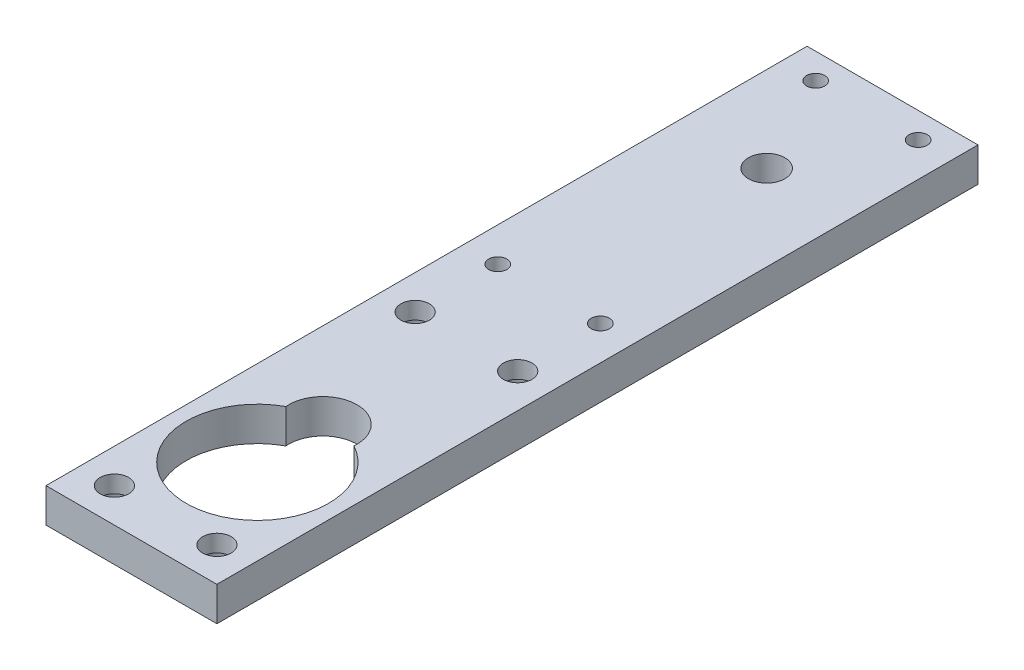
ISO-10303-21;
HEADER;
FILE_DESCRIPTION(('STEP AP214'),'2;1');
FILE_NAME('part.step','',(''),(''),'','','');
FILE_SCHEMA(('AUTOMOTIVE_DESIGN { 1 0 10303 214 1 1 1 1 }'));
ENDSEC;
DATA;
#1=APPLICATION_CONTEXT('core data for automotive mechanical design processes');
#2=APPLICATION_PROTOCOL_DEFINITION('international standard','automotive_design',2000,#1);
#3=PRODUCT_CONTEXT('',#1,'mechanical');
#4=PRODUCT('Part','Part','',(#3));
#5=PRODUCT_RELATED_PRODUCT_CATEGORY('part','',(#4));
#6=PRODUCT_DEFINITION_FORMATION('','',#4);
#7=PRODUCT_DEFINITION_CONTEXT('part definition',#1,'design');
#8=PRODUCT_DEFINITION('design','',#6,#7);
#9=PRODUCT_DEFINITION_SHAPE('','',#8);
#10=(LENGTH_UNIT() NAMED_UNIT(*) SI_UNIT(.MILLI.,.METRE.));
#11=(NAMED_UNIT(*) PLANE_ANGLE_UNIT() SI_UNIT($,.RADIAN.));
#12=(NAMED_UNIT(*) SI_UNIT($,.STERADIAN.) SOLID_ANGLE_UNIT());
#13=UNCERTAINTY_MEASURE_WITH_UNIT(LENGTH_MEASURE(1.E-05),#10,'distance_accuracy_value','');
#14=(GEOMETRIC_REPRESENTATION_CONTEXT(3) GLOBAL_UNCERTAINTY_ASSIGNED_CONTEXT((#13)) GLOBAL_UNIT_ASSIGNED_CONTEXT((#10,
#11,#12)) REPRESENTATION_CONTEXT('',''));
#15=CARTESIAN_POINT('',(0.,0.,0.));
#16=DIRECTION('',(0.,0.,1.));
#17=DIRECTION('',(1.,0.,0.));
#18=AXIS2_PLACEMENT_3D('',#15,#16,#17);
#19=CARTESIAN_POINT('',(0.,3.,0.));
#20=DIRECTION('',(0.,-1.,0.));
#21=DIRECTION('',(0.,0.,-1.));
#22=AXIS2_PLACEMENT_3D('',#19,#20,#21);
#23=PLANE('',#22);
#24=CARTESIAN_POINT('',(12.,3.,3.));
#25=DIRECTION('',(0.,1.,0.));
#26=DIRECTION('',(0.,0.,1.));
#27=AXIS2_PLACEMENT_3D('',#24,#25,#26);
#28=CIRCLE('',#27,1.25);
#29=CARTESIAN_POINT('',(12.,3.,4.25));
#30=VERTEX_POINT('',#29);
#31=EDGE_CURVE('E708',#30,#30,#28,.T.);
#32=ORIENTED_EDGE('',*,*,#31,.F.);
#33=EDGE_LOOP('',(#32));
#34=FACE_BOUND('',#33,.T.);
#35=CARTESIAN_POINT('',(3.,3.,3.));
#36=DIRECTION('',(0.,1.,0.));
#37=DIRECTION('',(0.,0.,1.));
#38=AXIS2_PLACEMENT_3D('',#35,#36,#37);
#39=CIRCLE('',#38,1.25);
#40=CARTESIAN_POINT('',(3.,3.,4.25));
#41=VERTEX_POINT('',#40);
#42=EDGE_CURVE('E713',#41,#41,#39,.T.);
#43=ORIENTED_EDGE('',*,*,#42,.F.);
#44=EDGE_LOOP('',(#43));
#45=FACE_BOUND('',#44,.T.);
#46=DIRECTION('',(0.,0.,1.));
#47=VECTOR('',#46,1.);
#48=CARTESIAN_POINT('',(15.,3.,0.));
#49=LINE('',#48,#47);
#50=CARTESIAN_POINT('',(15.,3.,-34.4));
#51=VERTEX_POINT('',#50);
#52=CARTESIAN_POINT('',(15.,3.,32.4));
#53=VERTEX_POINT('',#52);
#54=EDGE_CURVE('E264',#51,#53,#49,.T.);
#55=ORIENTED_EDGE('',*,*,#54,.F.);
#56=DIRECTION('',(1.,0.,0.));
#57=VECTOR('',#56,1.);
#58=CARTESIAN_POINT('',(0.,3.,-34.4));
#59=LINE('',#58,#57);
#60=CARTESIAN_POINT('',(0.,3.,-34.4));
#61=VERTEX_POINT('',#60);
#62=EDGE_CURVE('E274',#61,#51,#59,.T.);
#63=ORIENTED_EDGE('',*,*,#62,.F.);
#64=DIRECTION('',(0.,0.,1.));
#65=VECTOR('',#64,1.);
#66=CARTESIAN_POINT('',(0.,3.,0.));
#67=LINE('',#66,#65);
#68=CARTESIAN_POINT('',(0.,3.,32.4));
#69=VERTEX_POINT('',#68);
#70=EDGE_CURVE('E269',#61,#69,#67,.T.);
#71=ORIENTED_EDGE('',*,*,#70,.T.);
#72=DIRECTION('',(1.,0.,0.));
#73=VECTOR('',#72,1.);
#74=CARTESIAN_POINT('',(0.,3.,32.4));
#75=LINE('',#74,#73);
#76=EDGE_CURVE('E718',#69,#53,#75,.T.);
#77=ORIENTED_EDGE('',*,*,#76,.T.);
#78=EDGE_LOOP('',(#55,#63,#71,#77));
#79=FACE_BOUND('',#78,.T.);
#80=CARTESIAN_POINT('',(7.5,3.,21.35));
#81=DIRECTION('',(0.,1.,0.));
#82=DIRECTION('',(0.,0.,1.));
#83=AXIS2_PLACEMENT_3D('',#80,#81,#82);
#84=CIRCLE('',#83,6.25);
#85=CARTESIAN_POINT('',(4.51136367720271,3.,15.8608695652174));
#86=VERTEX_POINT('',#85);
#87=CARTESIAN_POINT('',(10.4886363227973,3.,15.8608695652174));
#88=VERTEX_POINT('',#87);
#89=EDGE_CURVE('E225',#86,#88,#84,.T.);
#90=ORIENTED_EDGE('',*,*,#89,.F.);
#91=CARTESIAN_POINT('',(7.5,3.,15.6));
#92=DIRECTION('',(0.,1.,0.));
#93=DIRECTION('',(0.,0.,1.));
#94=AXIS2_PLACEMENT_3D('',#91,#92,#93);
#95=CIRCLE('',#94,3.);
#96=EDGE_CURVE('E705',#88,#86,#95,.T.);
#97=ORIENTED_EDGE('',*,*,#96,.F.);
#98=EDGE_LOOP('',(#90,#97));
#99=FACE_BOUND('',#98,.T.);
#100=CARTESIAN_POINT('',(3.,3.,29.4));
#101=DIRECTION('',(0.,1.,0.));
#102=DIRECTION('',(0.,0.,1.));
#103=AXIS2_PLACEMENT_3D('',#100,#101,#102);
#104=CIRCLE('',#103,1.25);
#105=CARTESIAN_POINT('',(3.,3.,30.65));
#106=VERTEX_POINT('',#105);
#107=EDGE_CURVE('E697',#106,#106,#104,.T.);
#108=ORIENTED_EDGE('',*,*,#107,.F.);
#109=EDGE_LOOP('',(#108));
#110=FACE_BOUND('',#109,.T.);
#111=CARTESIAN_POINT('',(12.,3.,29.4));
#112=DIRECTION('',(0.,1.,0.));
#113=DIRECTION('',(0.,0.,1.));
#114=AXIS2_PLACEMENT_3D('',#111,#112,#113);
#115=CIRCLE('',#114,1.25);
#116=CARTESIAN_POINT('',(12.,3.,30.65));
#117=VERTEX_POINT('',#116);
#118=EDGE_CURVE('E284',#117,#117,#115,.T.);
#119=ORIENTED_EDGE('',*,*,#118,.F.);
#120=EDGE_LOOP('',(#119));
#121=FACE_BOUND('',#120,.T.);
#122=CARTESIAN_POINT('',(2.99999999999001,3.,-32.149999999996));
#123=DIRECTION('',(0.,1.,0.));
#124=DIRECTION('',(0.,0.,1.));
#125=AXIS2_PLACEMENT_3D('',#122,#123,#124);
#126=CIRCLE('',#125,0.800000000000002);
#127=CARTESIAN_POINT('',(2.99999999999001,3.,-31.349999999996));
#128=VERTEX_POINT('',#127);
#129=EDGE_CURVE('E312',#128,#128,#126,.T.);
#130=ORIENTED_EDGE('',*,*,#129,.F.);
#131=EDGE_LOOP('',(#130));
#132=FACE_BOUND('',#131,.T.);
#133=CARTESIAN_POINT('',(11.99999999999,3.,-4.24999999999597));
#134=DIRECTION('',(0.,1.,0.));
#135=DIRECTION('',(0.,0.,1.));
#136=AXIS2_PLACEMENT_3D('',#133,#134,#135);
#137=CIRCLE('',#136,0.799999999999999);
#138=CARTESIAN_POINT('',(11.99999999999,3.,-3.44999999999597));
#139=VERTEX_POINT('',#138);
#140=EDGE_CURVE('E280',#139,#139,#137,.T.);
#141=ORIENTED_EDGE('',*,*,#140,.F.);
#142=EDGE_LOOP('',(#141));
#143=FACE_BOUND('',#142,.T.);
#144=CARTESIAN_POINT('',(2.99999999999001,3.,-4.24999999999597));
#145=DIRECTION('',(0.,1.,0.));
#146=DIRECTION('',(0.,0.,1.));
#147=AXIS2_PLACEMENT_3D('',#144,#145,#146);
#148=CIRCLE('',#147,0.800000000000001);
#149=CARTESIAN_POINT('',(2.99999999999001,3.,-3.44999999999596));
#150=VERTEX_POINT('',#149);
#151=EDGE_CURVE('E276',#150,#150,#148,.T.);
#152=ORIENTED_EDGE('',*,*,#151,.F.);
#153=EDGE_LOOP('',(#152));
#154=FACE_BOUND('',#153,.T.);
#155=CARTESIAN_POINT('',(7.5,3.,-23.35));
#156=DIRECTION('',(0.,1.,0.));
#157=DIRECTION('',(0.,0.,1.));
#158=AXIS2_PLACEMENT_3D('',#155,#156,#157);
#159=CIRCLE('',#158,1.6);
#160=CARTESIAN_POINT('',(7.5,3.,-21.75));
#161=VERTEX_POINT('',#160);
#162=EDGE_CURVE('E321',#161,#161,#159,.T.);
#163=ORIENTED_EDGE('',*,*,#162,.F.);
#164=EDGE_LOOP('',(#163));
#165=FACE_BOUND('',#164,.T.);
#166=CARTESIAN_POINT('',(11.99999999999,3.,-32.149999999996));
#167=DIRECTION('',(0.,1.,0.));
#168=DIRECTION('',(0.,0.,1.));
#169=AXIS2_PLACEMENT_3D('',#166,#167,#168);
#170=CIRCLE('',#169,0.800000000000005);
#171=CARTESIAN_POINT('',(11.99999999999,3.,-31.349999999996));
#172=VERTEX_POINT('',#171);
#173=EDGE_CURVE('E308',#172,#172,#170,.T.);
#174=ORIENTED_EDGE('',*,*,#173,.F.);
#175=EDGE_LOOP('',(#174));
#176=FACE_BOUND('',#175,.T.);
#177=ADVANCED_FACE('F206',(#34,#45,#79,#99,#110,#121,#132,#143,#154,#165,#176),#23,.F.);
#178=CARTESIAN_POINT('',(0.,0.,0.));
#179=DIRECTION('',(0.,-1.,0.));
#180=DIRECTION('',(0.,0.,-1.));
#181=AXIS2_PLACEMENT_3D('',#178,#179,#180);
#182=PLANE('',#181);
#183=CARTESIAN_POINT('',(3.,0.,3.));
#184=DIRECTION('',(0.,1.,0.));
#185=DIRECTION('',(0.,0.,1.));
#186=AXIS2_PLACEMENT_3D('',#183,#184,#185);
#187=CIRCLE('',#186,2.);
#188=CARTESIAN_POINT('',(3.,0.,5.));
#189=VERTEX_POINT('',#188);
#190=EDGE_CURVE('E666',#189,#189,#187,.T.);
#191=ORIENTED_EDGE('',*,*,#190,.T.);
#192=EDGE_LOOP('',(#191));
#193=FACE_BOUND('',#192,.T.);
#194=CARTESIAN_POINT('',(3.,0.,29.4));
#195=DIRECTION('',(0.,1.,0.));
#196=DIRECTION('',(0.,0.,1.));
#197=AXIS2_PLACEMENT_3D('',#194,#195,#196);
#198=CIRCLE('',#197,2.);
#199=CARTESIAN_POINT('',(3.,0.,31.4));
#200=VERTEX_POINT('',#199);
#201=EDGE_CURVE('E667',#200,#200,#198,.T.);
#202=ORIENTED_EDGE('',*,*,#201,.T.);
#203=EDGE_LOOP('',(#202));
#204=FACE_BOUND('',#203,.T.);
#205=CARTESIAN_POINT('',(12.,0.,29.4));
#206=DIRECTION('',(0.,1.,0.));
#207=DIRECTION('',(0.,0.,1.));
#208=AXIS2_PLACEMENT_3D('',#205,#206,#207);
#209=CIRCLE('',#208,2.);
#210=CARTESIAN_POINT('',(12.,0.,31.4));
#211=VERTEX_POINT('',#210);
#212=EDGE_CURVE('E678',#211,#211,#209,.T.);
#213=ORIENTED_EDGE('',*,*,#212,.T.);
#214=EDGE_LOOP('',(#213));
#215=FACE_BOUND('',#214,.T.);
#216=CARTESIAN_POINT('',(11.99999999999,0.,-4.24999999999597));
#217=DIRECTION('',(0.,1.,0.));
#218=DIRECTION('',(0.,0.,1.));
#219=AXIS2_PLACEMENT_3D('',#216,#217,#218);
#220=CIRCLE('',#219,1.3);
#221=CARTESIAN_POINT('',(11.99999999999,0.,-2.94999999999597));
#222=VERTEX_POINT('',#221);
#223=EDGE_CURVE('E684',#222,#222,#220,.T.);
#224=ORIENTED_EDGE('',*,*,#223,.T.);
#225=EDGE_LOOP('',(#224));
#226=FACE_BOUND('',#225,.T.);
#227=CARTESIAN_POINT('',(11.99999999999,0.,-32.149999999996));
#228=DIRECTION('',(0.,1.,0.));
#229=DIRECTION('',(0.,0.,1.));
#230=AXIS2_PLACEMENT_3D('',#227,#228,#229);
#231=CIRCLE('',#230,1.3);
#232=CARTESIAN_POINT('',(11.99999999999,0.,-30.849999999996));
#233=VERTEX_POINT('',#232);
#234=EDGE_CURVE('E690',#233,#233,#231,.T.);
#235=ORIENTED_EDGE('',*,*,#234,.T.);
#236=EDGE_LOOP('',(#235));
#237=FACE_BOUND('',#236,.T.);
#238=CARTESIAN_POINT('',(2.99999999999001,0.,-32.149999999996));
#239=DIRECTION('',(0.,1.,0.));
#240=DIRECTION('',(0.,0.,1.));
#241=AXIS2_PLACEMENT_3D('',#238,#239,#240);
#242=CIRCLE('',#241,1.3);
#243=CARTESIAN_POINT('',(2.99999999999001,0.,-30.849999999996));
#244=VERTEX_POINT('',#243);
#245=EDGE_CURVE('E767',#244,#244,#242,.T.);
#246=ORIENTED_EDGE('',*,*,#245,.T.);
#247=EDGE_LOOP('',(#246));
#248=FACE_BOUND('',#247,.T.);
#249=CARTESIAN_POINT('',(2.99999999999001,0.,-4.24999999999597));
#250=DIRECTION('',(0.,1.,0.));
#251=DIRECTION('',(0.,0.,1.));
#252=AXIS2_PLACEMENT_3D('',#249,#250,#251);
#253=CIRCLE('',#252,1.3);
#254=CARTESIAN_POINT('',(2.99999999999001,0.,-2.94999999999597));
#255=VERTEX_POINT('',#254);
#256=EDGE_CURVE('E775',#255,#255,#253,.T.);
#257=ORIENTED_EDGE('',*,*,#256,.T.);
#258=EDGE_LOOP('',(#257));
#259=FACE_BOUND('',#258,.T.);
#260=CARTESIAN_POINT('',(12.,0.,3.));
#261=DIRECTION('',(0.,1.,0.));
#262=DIRECTION('',(0.,0.,1.));
#263=AXIS2_PLACEMENT_3D('',#260,#261,#262);
#264=CIRCLE('',#263,2.);
#265=CARTESIAN_POINT('',(12.,0.,5.));
#266=VERTEX_POINT('',#265);
#267=EDGE_CURVE('E669',#266,#266,#264,.T.);
#268=ORIENTED_EDGE('',*,*,#267,.T.);
#269=EDGE_LOOP('',(#268));
#270=FACE_BOUND('',#269,.T.);
#271=DIRECTION('',(0.,0.,1.));
#272=VECTOR('',#271,1.);
#273=CARTESIAN_POINT('',(0.,0.,0.));
#274=LINE('',#273,#272);
#275=CARTESIAN_POINT('',(0.,0.,-34.4));
#276=VERTEX_POINT('',#275);
#277=CARTESIAN_POINT('',(0.,0.,32.4));
#278=VERTEX_POINT('',#277);
#279=EDGE_CURVE('E253',#276,#278,#274,.T.);
#280=ORIENTED_EDGE('',*,*,#279,.F.);
#281=DIRECTION('',(1.,0.,0.));
#282=VECTOR('',#281,1.);
#283=CARTESIAN_POINT('',(0.,0.,-34.4));
#284=LINE('',#283,#282);
#285=CARTESIAN_POINT('',(15.,0.,-34.4));
#286=VERTEX_POINT('',#285);
#287=EDGE_CURVE('E258',#276,#286,#284,.T.);
#288=ORIENTED_EDGE('',*,*,#287,.T.);
#289=DIRECTION('',(0.,0.,1.));
#290=VECTOR('',#289,1.);
#291=CARTESIAN_POINT('',(15.,0.,0.));
#292=LINE('',#291,#290);
#293=CARTESIAN_POINT('',(15.,0.,32.4));
#294=VERTEX_POINT('',#293);
#295=EDGE_CURVE('E246',#286,#294,#292,.T.);
#296=ORIENTED_EDGE('',*,*,#295,.T.);
#297=DIRECTION('',(1.,0.,0.));
#298=VECTOR('',#297,1.);
#299=CARTESIAN_POINT('',(0.,0.,32.4));
#300=LINE('',#299,#298);
#301=EDGE_CURVE('E260',#278,#294,#300,.T.);
#302=ORIENTED_EDGE('',*,*,#301,.F.);
#303=EDGE_LOOP('',(#280,#288,#296,#302));
#304=FACE_BOUND('',#303,.T.);
#305=CARTESIAN_POINT('',(7.5,0.,15.6));
#306=DIRECTION('',(0.,1.,0.));
#307=DIRECTION('',(0.,0.,1.));
#308=AXIS2_PLACEMENT_3D('',#305,#306,#307);
#309=CIRCLE('',#308,3.);
#310=CARTESIAN_POINT('',(10.4886363227973,0.,15.8608695652174));
#311=VERTEX_POINT('',#310);
#312=CARTESIAN_POINT('',(4.51136367720271,0.,15.8608695652174));
#313=VERTEX_POINT('',#312);
#314=EDGE_CURVE('E702',#311,#313,#309,.T.);
#315=ORIENTED_EDGE('',*,*,#314,.T.);
#316=CARTESIAN_POINT('',(7.5,0.,21.35));
#317=DIRECTION('',(0.,1.,0.));
#318=DIRECTION('',(0.,0.,1.));
#319=AXIS2_PLACEMENT_3D('',#316,#317,#318);
#320=CIRCLE('',#319,6.25);
#321=EDGE_CURVE('E700',#313,#311,#320,.T.);
#322=ORIENTED_EDGE('',*,*,#321,.T.);
#323=EDGE_LOOP('',(#315,#322));
#324=FACE_BOUND('',#323,.T.);
#325=CARTESIAN_POINT('',(7.5,0.,-23.35));
#326=DIRECTION('',(0.,1.,0.));
#327=DIRECTION('',(0.,0.,1.));
#328=AXIS2_PLACEMENT_3D('',#325,#326,#327);
#329=CIRCLE('',#328,1.6);
#330=CARTESIAN_POINT('',(7.5,0.,-21.75));
#331=VERTEX_POINT('',#330);
#332=EDGE_CURVE('E317',#331,#331,#329,.T.);
#333=ORIENTED_EDGE('',*,*,#332,.T.);
#334=EDGE_LOOP('',(#333));
#335=FACE_BOUND('',#334,.T.);
#336=ADVANCED_FACE('F255',(#193,#204,#215,#226,#237,#248,#259,#270,#304,#324,#335),#182,.T.);
#337=CARTESIAN_POINT('',(7.5,3.,15.6));
#338=DIRECTION('',(0.,-1.,0.));
#339=DIRECTION('',(0.,0.,-1.));
#340=AXIS2_PLACEMENT_3D('',#337,#338,#339);
#341=CYLINDRICAL_SURFACE('',#340,3.);
#342=ORIENTED_EDGE('',*,*,#96,.T.);
#343=DIRECTION('',(0.,-1.,0.));
#344=VECTOR('',#343,1.);
#345=CARTESIAN_POINT('',(4.51136367720271,1.5,15.8608695652174));
#346=LINE('',#345,#344);
#347=EDGE_CURVE('E12',#86,#313,#346,.T.);
#348=ORIENTED_EDGE('',*,*,#347,.T.);
#349=ORIENTED_EDGE('',*,*,#314,.F.);
#350=DIRECTION('',(0.,-1.,0.));
#351=VECTOR('',#350,1.);
#352=CARTESIAN_POINT('',(10.4886363227973,1.5,15.8608695652174));
#353=LINE('',#352,#351);
#354=EDGE_CURVE('E216',#311,#88,#353,.F.);
#355=ORIENTED_EDGE('',*,*,#354,.T.);
#356=EDGE_LOOP('',(#342,#348,#349,#355));
#357=FACE_BOUND('',#356,.T.);
#358=ADVANCED_FACE('F350',(#357),#341,.F.);
#359=CARTESIAN_POINT('',(0.,3.,0.));
#360=DIRECTION('',(1.,0.,0.));
#361=DIRECTION('',(0.,0.,-1.));
#362=AXIS2_PLACEMENT_3D('',#359,#360,#361);
#363=PLANE('',#362);
#364=ORIENTED_EDGE('',*,*,#279,.T.);
#365=DIRECTION('',(0.,-1.,0.));
#366=VECTOR('',#365,1.);
#367=CARTESIAN_POINT('',(0.,3.,32.4));
#368=LINE('',#367,#366);
#369=EDGE_CURVE('E725',#69,#278,#368,.T.);
#370=ORIENTED_EDGE('',*,*,#369,.F.);
#371=ORIENTED_EDGE('',*,*,#70,.F.);
#372=DIRECTION('',(0.,-1.,0.));
#373=VECTOR('',#372,1.);
#374=CARTESIAN_POINT('',(0.,3.,-34.4));
#375=LINE('',#374,#373);
#376=EDGE_CURVE('E267',#61,#276,#375,.T.);
#377=ORIENTED_EDGE('',*,*,#376,.T.);
#378=EDGE_LOOP('',(#364,#370,#371,#377));
#379=FACE_BOUND('',#378,.T.);
#380=ADVANCED_FACE('F268',(#379),#363,.F.);
#381=CARTESIAN_POINT('',(0.,3.,32.4));
#382=DIRECTION('',(0.,0.,-1.));
#383=DIRECTION('',(-1.,0.,0.));
#384=AXIS2_PLACEMENT_3D('',#381,#382,#383);
#385=PLANE('',#384);
#386=ORIENTED_EDGE('',*,*,#301,.T.);
#387=DIRECTION('',(0.,-1.,0.));
#388=VECTOR('',#387,1.);
#389=CARTESIAN_POINT('',(15.,3.,32.4));
#390=LINE('',#389,#388);
#391=EDGE_CURVE('E722',#53,#294,#390,.T.);
#392=ORIENTED_EDGE('',*,*,#391,.F.);
#393=ORIENTED_EDGE('',*,*,#76,.F.);
#394=ORIENTED_EDGE('',*,*,#369,.T.);
#395=EDGE_LOOP('',(#386,#392,#393,#394));
#396=FACE_BOUND('',#395,.T.);
#397=ADVANCED_FACE('F390',(#396),#385,.F.);
#398=CARTESIAN_POINT('',(15.,3.,0.));
#399=DIRECTION('',(1.,0.,0.));
#400=DIRECTION('',(0.,0.,-1.));
#401=AXIS2_PLACEMENT_3D('',#398,#399,#400);
#402=PLANE('',#401);
#403=ORIENTED_EDGE('',*,*,#295,.F.);
#404=DIRECTION('',(0.,-1.,0.));
#405=VECTOR('',#404,1.);
#406=CARTESIAN_POINT('',(15.,3.,-34.4));
#407=LINE('',#406,#405);
#408=EDGE_CURVE('E273',#51,#286,#407,.T.);
#409=ORIENTED_EDGE('',*,*,#408,.F.);
#410=ORIENTED_EDGE('',*,*,#54,.T.);
#411=ORIENTED_EDGE('',*,*,#391,.T.);
#412=EDGE_LOOP('',(#403,#409,#410,#411));
#413=FACE_BOUND('',#412,.T.);
#414=ADVANCED_FACE('F386',(#413),#402,.T.);
#415=CARTESIAN_POINT('',(3.,3.,3.));
#416=DIRECTION('',(0.,-1.,0.));
#417=DIRECTION('',(0.,0.,-1.));
#418=AXIS2_PLACEMENT_3D('',#415,#416,#417);
#419=CYLINDRICAL_SURFACE('',#418,1.25);
#420=CARTESIAN_POINT('',(3.,1.5,3.));
#421=DIRECTION('',(0.,1.,0.));
#422=DIRECTION('',(0.,0.,1.));
#423=AXIS2_PLACEMENT_3D('',#420,#421,#422);
#424=CIRCLE('',#423,1.25);
#425=CARTESIAN_POINT('',(3.,1.5,4.25));
#426=VERTEX_POINT('',#425);
#427=EDGE_CURVE('E210',#426,#426,#424,.T.);
#428=ORIENTED_EDGE('',*,*,#427,.F.);
#429=EDGE_LOOP('',(#428));
#430=FACE_BOUND('',#429,.T.);
#431=ORIENTED_EDGE('',*,*,#42,.T.);
#432=EDGE_LOOP('',(#431));
#433=FACE_BOUND('',#432,.T.);
#434=ADVANCED_FACE('F389',(#430,#433),#419,.F.);
#435=CARTESIAN_POINT('',(12.,3.,3.));
#436=DIRECTION('',(0.,-1.,0.));
#437=DIRECTION('',(0.,0.,-1.));
#438=AXIS2_PLACEMENT_3D('',#435,#436,#437);
#439=CYLINDRICAL_SURFACE('',#438,1.25);
#440=CARTESIAN_POINT('',(12.,1.5,3.));
#441=DIRECTION('',(0.,1.,0.));
#442=DIRECTION('',(0.,0.,1.));
#443=AXIS2_PLACEMENT_3D('',#440,#441,#442);
#444=CIRCLE('',#443,1.25);
#445=CARTESIAN_POINT('',(12.,1.5,4.25));
#446=VERTEX_POINT('',#445);
#447=EDGE_CURVE('E303',#446,#446,#444,.T.);
#448=ORIENTED_EDGE('',*,*,#447,.F.);
#449=EDGE_LOOP('',(#448));
#450=FACE_BOUND('',#449,.T.);
#451=ORIENTED_EDGE('',*,*,#31,.T.);
#452=EDGE_LOOP('',(#451));
#453=FACE_BOUND('',#452,.T.);
#454=ADVANCED_FACE('F413',(#450,#453),#439,.F.);
#455=CARTESIAN_POINT('',(7.5,3.,21.35));
#456=DIRECTION('',(0.,-1.,0.));
#457=DIRECTION('',(0.,0.,-1.));
#458=AXIS2_PLACEMENT_3D('',#455,#456,#457);
#459=CYLINDRICAL_SURFACE('',#458,6.25);
#460=ORIENTED_EDGE('',*,*,#89,.T.);
#461=ORIENTED_EDGE('',*,*,#354,.F.);
#462=ORIENTED_EDGE('',*,*,#321,.F.);
#463=ORIENTED_EDGE('',*,*,#347,.F.);
#464=EDGE_LOOP('',(#460,#461,#462,#463));
#465=FACE_BOUND('',#464,.T.);
#466=ADVANCED_FACE('F421',(#465),#459,.F.);
#467=CARTESIAN_POINT('',(3.,3.,29.4));
#468=DIRECTION('',(0.,-1.,0.));
#469=DIRECTION('',(0.,0.,-1.));
#470=AXIS2_PLACEMENT_3D('',#467,#468,#469);
#471=CYLINDRICAL_SURFACE('',#470,1.25);
#472=CARTESIAN_POINT('',(3.,1.5,29.4));
#473=DIRECTION('',(0.,1.,0.));
#474=DIRECTION('',(0.,0.,1.));
#475=AXIS2_PLACEMENT_3D('',#472,#473,#474);
#476=CIRCLE('',#475,1.25);
#477=CARTESIAN_POINT('',(3.,1.5,30.65));
#478=VERTEX_POINT('',#477);
#479=EDGE_CURVE('E301',#478,#478,#476,.T.);
#480=ORIENTED_EDGE('',*,*,#479,.F.);
#481=EDGE_LOOP('',(#480));
#482=FACE_BOUND('',#481,.T.);
#483=ORIENTED_EDGE('',*,*,#107,.T.);
#484=EDGE_LOOP('',(#483));
#485=FACE_BOUND('',#484,.T.);
#486=ADVANCED_FACE('F429',(#482,#485),#471,.F.);
#487=CARTESIAN_POINT('',(12.,3.,29.4));
#488=DIRECTION('',(0.,-1.,0.));
#489=DIRECTION('',(0.,0.,-1.));
#490=AXIS2_PLACEMENT_3D('',#487,#488,#489);
#491=CYLINDRICAL_SURFACE('',#490,1.25);
#492=CARTESIAN_POINT('',(12.,1.5,29.4));
#493=DIRECTION('',(0.,1.,0.));
#494=DIRECTION('',(0.,0.,1.));
#495=AXIS2_PLACEMENT_3D('',#492,#493,#494);
#496=CIRCLE('',#495,1.25);
#497=CARTESIAN_POINT('',(12.,1.5,30.65));
#498=VERTEX_POINT('',#497);
#499=EDGE_CURVE('E298',#498,#498,#496,.T.);
#500=ORIENTED_EDGE('',*,*,#499,.F.);
#501=EDGE_LOOP('',(#500));
#502=FACE_BOUND('',#501,.T.);
#503=ORIENTED_EDGE('',*,*,#118,.T.);
#504=EDGE_LOOP('',(#503));
#505=FACE_BOUND('',#504,.T.);
#506=ADVANCED_FACE('F370',(#502,#505),#491,.F.);
#507=CARTESIAN_POINT('',(11.99999999999,3.,-32.149999999996));
#508=DIRECTION('',(0.,-1.,0.));
#509=DIRECTION('',(0.,0.,-1.));
#510=AXIS2_PLACEMENT_3D('',#507,#508,#509);
#511=CYLINDRICAL_SURFACE('',#510,0.800000000000005);
#512=CARTESIAN_POINT('',(11.99999999999,1.5,-32.149999999996));
#513=DIRECTION('',(0.,1.,0.));
#514=DIRECTION('',(0.,0.,1.));
#515=AXIS2_PLACEMENT_3D('',#512,#513,#514);
#516=CIRCLE('',#515,0.800000000000005);
#517=CARTESIAN_POINT('',(11.99999999999,1.5,-31.349999999996));
#518=VERTEX_POINT('',#517);
#519=EDGE_CURVE('E295',#518,#518,#516,.T.);
#520=ORIENTED_EDGE('',*,*,#519,.F.);
#521=EDGE_LOOP('',(#520));
#522=FACE_BOUND('',#521,.T.);
#523=ORIENTED_EDGE('',*,*,#173,.T.);
#524=EDGE_LOOP('',(#523));
#525=FACE_BOUND('',#524,.T.);
#526=ADVANCED_FACE('F335',(#522,#525),#511,.F.);
#527=CARTESIAN_POINT('',(7.5,3.,-23.35));
#528=DIRECTION('',(0.,-1.,0.));
#529=DIRECTION('',(0.,0.,-1.));
#530=AXIS2_PLACEMENT_3D('',#527,#528,#529);
#531=CYLINDRICAL_SURFACE('',#530,1.6);
#532=ORIENTED_EDGE('',*,*,#162,.T.);
#533=EDGE_LOOP('',(#532));
#534=FACE_BOUND('',#533,.T.);
#535=ORIENTED_EDGE('',*,*,#332,.F.);
#536=EDGE_LOOP('',(#535));
#537=FACE_BOUND('',#536,.T.);
#538=ADVANCED_FACE('F341',(#534,#537),#531,.F.);
#539=CARTESIAN_POINT('',(2.99999999999001,3.,-4.24999999999597));
#540=DIRECTION('',(0.,-1.,0.));
#541=DIRECTION('',(0.,0.,-1.));
#542=AXIS2_PLACEMENT_3D('',#539,#540,#541);
#543=CYLINDRICAL_SURFACE('',#542,0.800000000000001);
#544=CARTESIAN_POINT('',(2.99999999999001,1.5,-4.24999999999597));
#545=DIRECTION('',(0.,1.,0.));
#546=DIRECTION('',(0.,0.,1.));
#547=AXIS2_PLACEMENT_3D('',#544,#545,#546);
#548=CIRCLE('',#547,0.800000000000001);
#549=CARTESIAN_POINT('',(2.99999999999001,1.5,-3.44999999999596));
#550=VERTEX_POINT('',#549);
#551=EDGE_CURVE('E292',#550,#550,#548,.T.);
#552=ORIENTED_EDGE('',*,*,#551,.F.);
#553=EDGE_LOOP('',(#552));
#554=FACE_BOUND('',#553,.T.);
#555=ORIENTED_EDGE('',*,*,#151,.T.);
#556=EDGE_LOOP('',(#555));
#557=FACE_BOUND('',#556,.T.);
#558=ADVANCED_FACE('F344',(#554,#557),#543,.F.);
#559=CARTESIAN_POINT('',(11.99999999999,3.,-4.24999999999597));
#560=DIRECTION('',(0.,-1.,0.));
#561=DIRECTION('',(0.,0.,-1.));
#562=AXIS2_PLACEMENT_3D('',#559,#560,#561);
#563=CYLINDRICAL_SURFACE('',#562,0.799999999999999);
#564=CARTESIAN_POINT('',(11.99999999999,1.5,-4.24999999999597));
#565=DIRECTION('',(0.,1.,0.));
#566=DIRECTION('',(0.,0.,1.));
#567=AXIS2_PLACEMENT_3D('',#564,#565,#566);
#568=CIRCLE('',#567,0.799999999999999);
#569=CARTESIAN_POINT('',(11.99999999999,1.5,-3.44999999999597));
#570=VERTEX_POINT('',#569);
#571=EDGE_CURVE('E288',#570,#570,#568,.T.);
#572=ORIENTED_EDGE('',*,*,#571,.F.);
#573=EDGE_LOOP('',(#572));
#574=FACE_BOUND('',#573,.T.);
#575=ORIENTED_EDGE('',*,*,#140,.T.);
#576=EDGE_LOOP('',(#575));
#577=FACE_BOUND('',#576,.T.);
#578=ADVANCED_FACE('F329',(#574,#577),#563,.F.);
#579=CARTESIAN_POINT('',(2.99999999999001,3.,-32.149999999996));
#580=DIRECTION('',(0.,-1.,0.));
#581=DIRECTION('',(0.,0.,-1.));
#582=AXIS2_PLACEMENT_3D('',#579,#580,#581);
#583=CYLINDRICAL_SURFACE('',#582,0.800000000000002);
#584=CARTESIAN_POINT('',(2.99999999999001,1.5,-32.149999999996));
#585=DIRECTION('',(0.,1.,0.));
#586=DIRECTION('',(0.,0.,1.));
#587=AXIS2_PLACEMENT_3D('',#584,#585,#586);
#588=CIRCLE('',#587,0.800000000000002);
#589=CARTESIAN_POINT('',(2.99999999999001,1.5,-31.349999999996));
#590=VERTEX_POINT('',#589);
#591=EDGE_CURVE('E285',#590,#590,#588,.T.);
#592=ORIENTED_EDGE('',*,*,#591,.F.);
#593=EDGE_LOOP('',(#592));
#594=FACE_BOUND('',#593,.T.);
#595=ORIENTED_EDGE('',*,*,#129,.T.);
#596=EDGE_LOOP('',(#595));
#597=FACE_BOUND('',#596,.T.);
#598=ADVANCED_FACE('F346',(#594,#597),#583,.F.);
#599=CARTESIAN_POINT('',(0.,3.,-34.4));
#600=DIRECTION('',(0.,0.,-1.));
#601=DIRECTION('',(-1.,0.,0.));
#602=AXIS2_PLACEMENT_3D('',#599,#600,#601);
#603=PLANE('',#602);
#604=ORIENTED_EDGE('',*,*,#287,.F.);
#605=ORIENTED_EDGE('',*,*,#376,.F.);
#606=ORIENTED_EDGE('',*,*,#62,.T.);
#607=ORIENTED_EDGE('',*,*,#408,.T.);
#608=EDGE_LOOP('',(#604,#605,#606,#607));
#609=FACE_BOUND('',#608,.T.);
#610=ADVANCED_FACE('F208',(#609),#603,.T.);
#611=CARTESIAN_POINT('',(2.99999999999001,1.5,-32.149999999996));
#612=DIRECTION('',(0.,-1.,0.));
#613=DIRECTION('',(0.,0.,-1.));
#614=AXIS2_PLACEMENT_3D('',#611,#612,#613);
#615=CYLINDRICAL_SURFACE('',#614,1.3);
#616=CARTESIAN_POINT('',(2.99999999999001,1.5,-32.149999999996));
#617=DIRECTION('',(0.,1.,0.));
#618=DIRECTION('',(0.,0.,1.));
#619=AXIS2_PLACEMENT_3D('',#616,#617,#618);
#620=CIRCLE('',#619,1.3);
#621=CARTESIAN_POINT('',(2.99999999999001,1.5,-30.849999999996));
#622=VERTEX_POINT('',#621);
#623=EDGE_CURVE('E772',#622,#622,#620,.T.);
#624=ORIENTED_EDGE('',*,*,#623,.T.);
#625=EDGE_LOOP('',(#624));
#626=FACE_BOUND('',#625,.T.);
#627=ORIENTED_EDGE('',*,*,#245,.F.);
#628=EDGE_LOOP('',(#627));
#629=FACE_BOUND('',#628,.T.);
#630=ADVANCED_FACE('F362',(#626,#629),#615,.F.);
#631=CARTESIAN_POINT('',(2.99999999999001,1.5,-32.149999999996));
#632=DIRECTION('',(0.,1.,0.));
#633=DIRECTION('',(0.,0.,1.));
#634=AXIS2_PLACEMENT_3D('',#631,#632,#633);
#635=PLANE('',#634);
#636=ORIENTED_EDGE('',*,*,#591,.T.);
#637=EDGE_LOOP('',(#636));
#638=FACE_BOUND('',#637,.T.);
#639=ORIENTED_EDGE('',*,*,#623,.F.);
#640=EDGE_LOOP('',(#639));
#641=FACE_BOUND('',#640,.T.);
#642=ADVANCED_FACE('F367',(#638,#641),#635,.F.);
#643=CARTESIAN_POINT('',(11.99999999999,1.5,-4.24999999999597));
#644=DIRECTION('',(0.,-1.,0.));
#645=DIRECTION('',(0.,0.,-1.));
#646=AXIS2_PLACEMENT_3D('',#643,#644,#645);
#647=CYLINDRICAL_SURFACE('',#646,1.3);
#648=CARTESIAN_POINT('',(11.99999999999,1.5,-4.24999999999597));
#649=DIRECTION('',(0.,1.,0.));
#650=DIRECTION('',(0.,0.,1.));
#651=AXIS2_PLACEMENT_3D('',#648,#649,#650);
#652=CIRCLE('',#651,1.3);
#653=CARTESIAN_POINT('',(11.99999999999,1.5,-2.94999999999597));
#654=VERTEX_POINT('',#653);
#655=EDGE_CURVE('E687',#654,#654,#652,.T.);
#656=ORIENTED_EDGE('',*,*,#655,.T.);
#657=EDGE_LOOP('',(#656));
#658=FACE_BOUND('',#657,.T.);
#659=ORIENTED_EDGE('',*,*,#223,.F.);
#660=EDGE_LOOP('',(#659));
#661=FACE_BOUND('',#660,.T.);
#662=ADVANCED_FACE('F520',(#658,#661),#647,.F.);
#663=CARTESIAN_POINT('',(11.99999999999,1.5,-4.24999999999597));
#664=DIRECTION('',(0.,1.,0.));
#665=DIRECTION('',(0.,0.,1.));
#666=AXIS2_PLACEMENT_3D('',#663,#664,#665);
#667=PLANE('',#666);
#668=ORIENTED_EDGE('',*,*,#571,.T.);
#669=EDGE_LOOP('',(#668));
#670=FACE_BOUND('',#669,.T.);
#671=ORIENTED_EDGE('',*,*,#655,.F.);
#672=EDGE_LOOP('',(#671));
#673=FACE_BOUND('',#672,.T.);
#674=ADVANCED_FACE('F529',(#670,#673),#667,.F.);
#675=CARTESIAN_POINT('',(2.99999999999001,1.5,-4.24999999999597));
#676=DIRECTION('',(0.,-1.,0.));
#677=DIRECTION('',(0.,0.,-1.));
#678=AXIS2_PLACEMENT_3D('',#675,#676,#677);
#679=CYLINDRICAL_SURFACE('',#678,1.3);
#680=CARTESIAN_POINT('',(2.99999999999001,1.5,-4.24999999999597));
#681=DIRECTION('',(0.,1.,0.));
#682=DIRECTION('',(0.,0.,1.));
#683=AXIS2_PLACEMENT_3D('',#680,#681,#682);
#684=CIRCLE('',#683,1.3);
#685=CARTESIAN_POINT('',(2.99999999999001,1.5,-2.94999999999597));
#686=VERTEX_POINT('',#685);
#687=EDGE_CURVE('E777',#686,#686,#684,.T.);
#688=ORIENTED_EDGE('',*,*,#687,.T.);
#689=EDGE_LOOP('',(#688));
#690=FACE_BOUND('',#689,.T.);
#691=ORIENTED_EDGE('',*,*,#256,.F.);
#692=EDGE_LOOP('',(#691));
#693=FACE_BOUND('',#692,.T.);
#694=ADVANCED_FACE('F538',(#690,#693),#679,.F.);
#695=CARTESIAN_POINT('',(2.99999999999001,1.5,-4.24999999999597));
#696=DIRECTION('',(0.,1.,0.));
#697=DIRECTION('',(0.,0.,1.));
#698=AXIS2_PLACEMENT_3D('',#695,#696,#697);
#699=PLANE('',#698);
#700=ORIENTED_EDGE('',*,*,#551,.T.);
#701=EDGE_LOOP('',(#700));
#702=FACE_BOUND('',#701,.T.);
#703=ORIENTED_EDGE('',*,*,#687,.F.);
#704=EDGE_LOOP('',(#703));
#705=FACE_BOUND('',#704,.T.);
#706=ADVANCED_FACE('F547',(#702,#705),#699,.F.);
#707=CARTESIAN_POINT('',(11.99999999999,1.5,-32.149999999996));
#708=DIRECTION('',(0.,-1.,0.));
#709=DIRECTION('',(0.,0.,-1.));
#710=AXIS2_PLACEMENT_3D('',#707,#708,#709);
#711=CYLINDRICAL_SURFACE('',#710,1.3);
#712=CARTESIAN_POINT('',(11.99999999999,1.5,-32.149999999996));
#713=DIRECTION('',(0.,1.,0.));
#714=DIRECTION('',(0.,0.,1.));
#715=AXIS2_PLACEMENT_3D('',#712,#713,#714);
#716=CIRCLE('',#715,1.3);
#717=CARTESIAN_POINT('',(11.99999999999,1.5,-30.849999999996));
#718=VERTEX_POINT('',#717);
#719=EDGE_CURVE('E762',#718,#718,#716,.T.);
#720=ORIENTED_EDGE('',*,*,#719,.T.);
#721=EDGE_LOOP('',(#720));
#722=FACE_BOUND('',#721,.T.);
#723=ORIENTED_EDGE('',*,*,#234,.F.);
#724=EDGE_LOOP('',(#723));
#725=FACE_BOUND('',#724,.T.);
#726=ADVANCED_FACE('F556',(#722,#725),#711,.F.);
#727=CARTESIAN_POINT('',(11.99999999999,1.5,-32.149999999996));
#728=DIRECTION('',(0.,1.,0.));
#729=DIRECTION('',(0.,0.,1.));
#730=AXIS2_PLACEMENT_3D('',#727,#728,#729);
#731=PLANE('',#730);
#732=ORIENTED_EDGE('',*,*,#519,.T.);
#733=EDGE_LOOP('',(#732));
#734=FACE_BOUND('',#733,.T.);
#735=ORIENTED_EDGE('',*,*,#719,.F.);
#736=EDGE_LOOP('',(#735));
#737=FACE_BOUND('',#736,.T.);
#738=ADVANCED_FACE('F565',(#734,#737),#731,.F.);
#739=CARTESIAN_POINT('',(12.,1.5,29.4));
#740=DIRECTION('',(0.,-1.,0.));
#741=DIRECTION('',(0.,0.,-1.));
#742=AXIS2_PLACEMENT_3D('',#739,#740,#741);
#743=CYLINDRICAL_SURFACE('',#742,2.);
#744=CARTESIAN_POINT('',(12.,1.5,29.4));
#745=DIRECTION('',(0.,1.,0.));
#746=DIRECTION('',(0.,0.,1.));
#747=AXIS2_PLACEMENT_3D('',#744,#745,#746);
#748=CIRCLE('',#747,2.);
#749=CARTESIAN_POINT('',(12.,1.5,31.4));
#750=VERTEX_POINT('',#749);
#751=EDGE_CURVE('E681',#750,#750,#748,.T.);
#752=ORIENTED_EDGE('',*,*,#751,.T.);
#753=EDGE_LOOP('',(#752));
#754=FACE_BOUND('',#753,.T.);
#755=ORIENTED_EDGE('',*,*,#212,.F.);
#756=EDGE_LOOP('',(#755));
#757=FACE_BOUND('',#756,.T.);
#758=ADVANCED_FACE('F574',(#754,#757),#743,.F.);
#759=CARTESIAN_POINT('',(12.,1.5,29.4));
#760=DIRECTION('',(0.,1.,0.));
#761=DIRECTION('',(0.,0.,1.));
#762=AXIS2_PLACEMENT_3D('',#759,#760,#761);
#763=PLANE('',#762);
#764=ORIENTED_EDGE('',*,*,#499,.T.);
#765=EDGE_LOOP('',(#764));
#766=FACE_BOUND('',#765,.T.);
#767=ORIENTED_EDGE('',*,*,#751,.F.);
#768=EDGE_LOOP('',(#767));
#769=FACE_BOUND('',#768,.T.);
#770=ADVANCED_FACE('F583',(#766,#769),#763,.F.);
#771=CARTESIAN_POINT('',(3.,1.5,29.4));
#772=DIRECTION('',(0.,-1.,0.));
#773=DIRECTION('',(0.,0.,-1.));
#774=AXIS2_PLACEMENT_3D('',#771,#772,#773);
#775=CYLINDRICAL_SURFACE('',#774,2.);
#776=CARTESIAN_POINT('',(3.,1.5,29.4));
#777=DIRECTION('',(0.,1.,0.));
#778=DIRECTION('',(0.,0.,1.));
#779=AXIS2_PLACEMENT_3D('',#776,#777,#778);
#780=CIRCLE('',#779,2.);
#781=CARTESIAN_POINT('',(3.,1.5,31.4));
#782=VERTEX_POINT('',#781);
#783=EDGE_CURVE('E672',#782,#782,#780,.T.);
#784=ORIENTED_EDGE('',*,*,#783,.T.);
#785=EDGE_LOOP('',(#784));
#786=FACE_BOUND('',#785,.T.);
#787=ORIENTED_EDGE('',*,*,#201,.F.);
#788=EDGE_LOOP('',(#787));
#789=FACE_BOUND('',#788,.T.);
#790=ADVANCED_FACE('F592',(#786,#789),#775,.F.);
#791=CARTESIAN_POINT('',(3.,1.5,29.4));
#792=DIRECTION('',(0.,1.,0.));
#793=DIRECTION('',(0.,0.,1.));
#794=AXIS2_PLACEMENT_3D('',#791,#792,#793);
#795=PLANE('',#794);
#796=ORIENTED_EDGE('',*,*,#479,.T.);
#797=EDGE_LOOP('',(#796));
#798=FACE_BOUND('',#797,.T.);
#799=ORIENTED_EDGE('',*,*,#783,.F.);
#800=EDGE_LOOP('',(#799));
#801=FACE_BOUND('',#800,.T.);
#802=ADVANCED_FACE('F601',(#798,#801),#795,.F.);
#803=CARTESIAN_POINT('',(12.,1.5,3.));
#804=DIRECTION('',(0.,-1.,0.));
#805=DIRECTION('',(0.,0.,-1.));
#806=AXIS2_PLACEMENT_3D('',#803,#804,#805);
#807=CYLINDRICAL_SURFACE('',#806,2.);
#808=CARTESIAN_POINT('',(12.,1.5,3.));
#809=DIRECTION('',(0.,1.,0.));
#810=DIRECTION('',(0.,0.,1.));
#811=AXIS2_PLACEMENT_3D('',#808,#809,#810);
#812=CIRCLE('',#811,2.);
#813=CARTESIAN_POINT('',(12.,1.5,5.));
#814=VERTEX_POINT('',#813);
#815=EDGE_CURVE('E289',#814,#814,#812,.T.);
#816=ORIENTED_EDGE('',*,*,#815,.T.);
#817=EDGE_LOOP('',(#816));
#818=FACE_BOUND('',#817,.T.);
#819=ORIENTED_EDGE('',*,*,#267,.F.);
#820=EDGE_LOOP('',(#819));
#821=FACE_BOUND('',#820,.T.);
#822=ADVANCED_FACE('F610',(#818,#821),#807,.F.);
#823=CARTESIAN_POINT('',(12.,1.5,3.));
#824=DIRECTION('',(0.,1.,0.));
#825=DIRECTION('',(0.,0.,1.));
#826=AXIS2_PLACEMENT_3D('',#823,#824,#825);
#827=PLANE('',#826);
#828=ORIENTED_EDGE('',*,*,#447,.T.);
#829=EDGE_LOOP('',(#828));
#830=FACE_BOUND('',#829,.T.);
#831=ORIENTED_EDGE('',*,*,#815,.F.);
#832=EDGE_LOOP('',(#831));
#833=FACE_BOUND('',#832,.T.);
#834=ADVANCED_FACE('F619',(#830,#833),#827,.F.);
#835=CARTESIAN_POINT('',(3.,1.5,3.));
#836=DIRECTION('',(0.,-1.,0.));
#837=DIRECTION('',(0.,0.,-1.));
#838=AXIS2_PLACEMENT_3D('',#835,#836,#837);
#839=CYLINDRICAL_SURFACE('',#838,2.);
#840=CARTESIAN_POINT('',(3.,1.5,3.));
#841=DIRECTION('',(0.,1.,0.));
#842=DIRECTION('',(0.,0.,1.));
#843=AXIS2_PLACEMENT_3D('',#840,#841,#842);
#844=CIRCLE('',#843,2.);
#845=CARTESIAN_POINT('',(3.,1.5,5.));
#846=VERTEX_POINT('',#845);
#847=EDGE_CURVE('E665',#846,#846,#844,.T.);
#848=ORIENTED_EDGE('',*,*,#847,.T.);
#849=EDGE_LOOP('',(#848));
#850=FACE_BOUND('',#849,.T.);
#851=ORIENTED_EDGE('',*,*,#190,.F.);
#852=EDGE_LOOP('',(#851));
#853=FACE_BOUND('',#852,.T.);
#854=ADVANCED_FACE('F628',(#850,#853),#839,.F.);
#855=CARTESIAN_POINT('',(3.,1.5,3.));
#856=DIRECTION('',(0.,1.,0.));
#857=DIRECTION('',(0.,0.,1.));
#858=AXIS2_PLACEMENT_3D('',#855,#856,#857);
#859=PLANE('',#858);
#860=ORIENTED_EDGE('',*,*,#427,.T.);
#861=EDGE_LOOP('',(#860));
#862=FACE_BOUND('',#861,.T.);
#863=ORIENTED_EDGE('',*,*,#847,.F.);
#864=EDGE_LOOP('',(#863));
#865=FACE_BOUND('',#864,.T.);
#866=ADVANCED_FACE('F636',(#862,#865),#859,.F.);
#867=CLOSED_SHELL('',(#177,#336,#358,#380,#397,#414,#434,#454,#466,#486,#506,#526,#538,#558,
#578,#598,#610,#630,#642,#662,#674,#694,#706,#726,#738,#758,#770,#790,#802,#822,#834,#854,#866));
#868=MANIFOLD_SOLID_BREP('B2',#867);
#869=ADVANCED_BREP_SHAPE_REPRESENTATION('',(#18,#868),#14);
#870=SHAPE_DEFINITION_REPRESENTATION(#9,#869);
ENDSEC;
END-ISO-10303-21;
